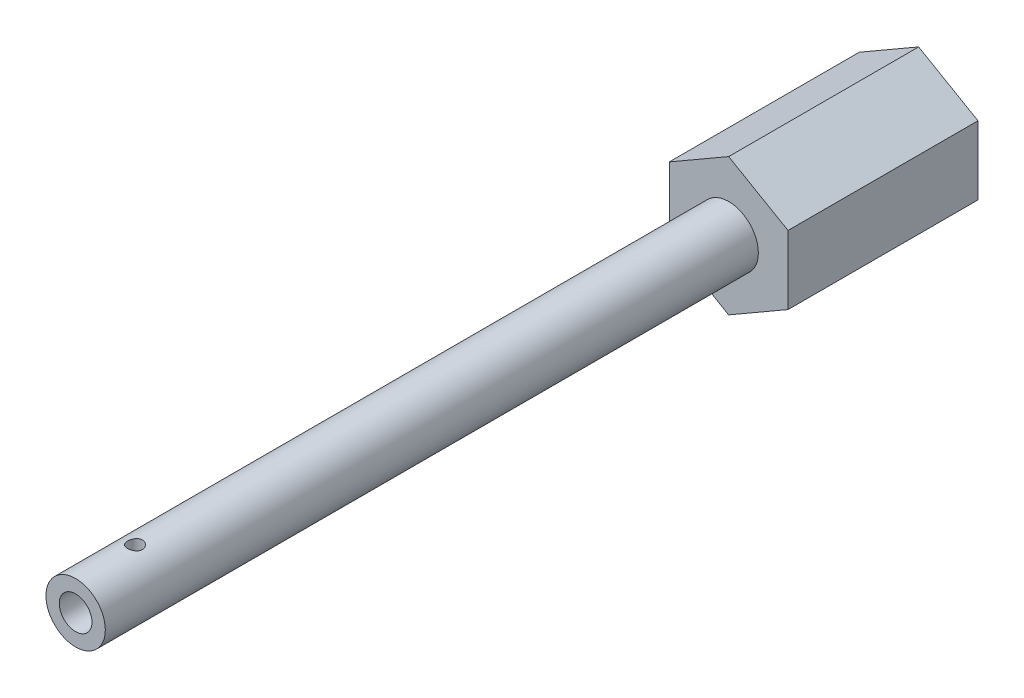
ISO-10303-21;
HEADER;
FILE_DESCRIPTION(('STEP AP214'),'2;1');
FILE_NAME('part.step','',(''),(''),'','','');
FILE_SCHEMA(('AUTOMOTIVE_DESIGN { 1 0 10303 214 1 1 1 1 }'));
ENDSEC;
DATA;
#1=APPLICATION_CONTEXT('core data for automotive mechanical design processes');
#2=APPLICATION_PROTOCOL_DEFINITION('international standard','automotive_design',2000,#1);
#3=PRODUCT_CONTEXT('',#1,'mechanical');
#4=PRODUCT('Part','Part','',(#3));
#5=PRODUCT_RELATED_PRODUCT_CATEGORY('part','',(#4));
#6=PRODUCT_DEFINITION_FORMATION('','',#4);
#7=PRODUCT_DEFINITION_CONTEXT('part definition',#1,'design');
#8=PRODUCT_DEFINITION('design','',#6,#7);
#9=PRODUCT_DEFINITION_SHAPE('','',#8);
#10=(LENGTH_UNIT() NAMED_UNIT(*) SI_UNIT(.MILLI.,.METRE.));
#11=(NAMED_UNIT(*) PLANE_ANGLE_UNIT() SI_UNIT($,.RADIAN.));
#12=(NAMED_UNIT(*) SI_UNIT($,.STERADIAN.) SOLID_ANGLE_UNIT());
#13=UNCERTAINTY_MEASURE_WITH_UNIT(LENGTH_MEASURE(1.E-05),#10,'distance_accuracy_value','');
#14=(GEOMETRIC_REPRESENTATION_CONTEXT(3) GLOBAL_UNCERTAINTY_ASSIGNED_CONTEXT((#13)) GLOBAL_UNIT_ASSIGNED_CONTEXT((#10,
#11,#12)) REPRESENTATION_CONTEXT('',''));
#15=CARTESIAN_POINT('',(0.,0.,0.));
#16=DIRECTION('',(0.,0.,1.));
#17=DIRECTION('',(1.,0.,0.));
#18=AXIS2_PLACEMENT_3D('',#15,#16,#17);
#19=CARTESIAN_POINT('',(6.35000000000004,-3.66617420935407,20.32));
#20=DIRECTION('',(-1.,0.,0.));
#21=DIRECTION('',(0.,-1.,0.));
#22=AXIS2_PLACEMENT_3D('',#19,#20,#21);
#23=PLANE('',#22);
#24=DIRECTION('',(0.,1.,0.));
#25=VECTOR('',#24,1.);
#26=CARTESIAN_POINT('',(6.35000000000004,-3.66617420935407,0.));
#27=LINE('',#26,#25);
#28=CARTESIAN_POINT('',(6.35000000000004,-3.66617420935407,0.));
#29=VERTEX_POINT('',#28);
#30=CARTESIAN_POINT('',(6.34999999999996,3.6661742093542,0.));
#31=VERTEX_POINT('',#30);
#32=EDGE_CURVE('E138',#29,#31,#27,.T.);
#33=ORIENTED_EDGE('',*,*,#32,.T.);
#34=DIRECTION('',(0.,0.,-1.));
#35=VECTOR('',#34,1.);
#36=CARTESIAN_POINT('',(6.34999999999996,3.6661742093542,20.32));
#37=LINE('',#36,#35);
#38=CARTESIAN_POINT('',(6.34999999999996,3.6661742093542,20.32));
#39=VERTEX_POINT('',#38);
#40=EDGE_CURVE('E56',#39,#31,#37,.T.);
#41=ORIENTED_EDGE('',*,*,#40,.F.);
#42=DIRECTION('',(0.,1.,0.));
#43=VECTOR('',#42,1.);
#44=CARTESIAN_POINT('',(6.35000000000004,-3.66617420935407,20.32));
#45=LINE('',#44,#43);
#46=CARTESIAN_POINT('',(6.35000000000004,-3.66617420935407,20.32));
#47=VERTEX_POINT('',#46);
#48=EDGE_CURVE('E147',#47,#39,#45,.T.);
#49=ORIENTED_EDGE('',*,*,#48,.F.);
#50=DIRECTION('',(0.,0.,-1.));
#51=VECTOR('',#50,1.);
#52=CARTESIAN_POINT('',(6.35000000000004,-3.66617420935407,20.32));
#53=LINE('',#52,#51);
#54=EDGE_CURVE('E131',#47,#29,#53,.T.);
#55=ORIENTED_EDGE('',*,*,#54,.T.);
#56=EDGE_LOOP('',(#33,#41,#49,#55));
#57=FACE_BOUND('',#56,.T.);
#58=ADVANCED_FACE('F44',(#57),#23,.F.);
#59=CARTESIAN_POINT('',(6.34999999999996,3.6661742093542,20.32));
#60=DIRECTION('',(-0.499999999999995,-0.866025403784442,0.));
#61=DIRECTION('',(0.866025403784442,-0.499999999999995,0.));
#62=AXIS2_PLACEMENT_3D('',#59,#60,#61);
#63=PLANE('',#62);
#64=DIRECTION('',(-0.866025403784441,0.499999999999995,0.));
#65=VECTOR('',#64,1.);
#66=CARTESIAN_POINT('',(6.34999999999996,3.6661742093542,0.));
#67=LINE('',#66,#65);
#68=CARTESIAN_POINT('',(0.,7.33234841870825,0.));
#69=VERTEX_POINT('',#68);
#70=EDGE_CURVE('E142',#31,#69,#67,.T.);
#71=ORIENTED_EDGE('',*,*,#70,.T.);
#72=DIRECTION('',(0.,0.,-1.));
#73=VECTOR('',#72,1.);
#74=CARTESIAN_POINT('',(0.,7.33234841870825,20.32));
#75=LINE('',#74,#73);
#76=CARTESIAN_POINT('',(0.,7.33234841870825,20.32));
#77=VERTEX_POINT('',#76);
#78=EDGE_CURVE('E152',#77,#69,#75,.T.);
#79=ORIENTED_EDGE('',*,*,#78,.F.);
#80=DIRECTION('',(-0.866025403784441,0.499999999999995,0.));
#81=VECTOR('',#80,1.);
#82=CARTESIAN_POINT('',(6.34999999999996,3.6661742093542,20.32));
#83=LINE('',#82,#81);
#84=EDGE_CURVE('E110',#39,#77,#83,.T.);
#85=ORIENTED_EDGE('',*,*,#84,.F.);
#86=ORIENTED_EDGE('',*,*,#40,.T.);
#87=EDGE_LOOP('',(#71,#79,#85,#86));
#88=FACE_BOUND('',#87,.T.);
#89=ADVANCED_FACE('F209',(#88),#63,.F.);
#90=CARTESIAN_POINT('',(0.,7.33234841870825,20.32));
#91=DIRECTION('',(0.500000000000001,-0.866025403784438,0.));
#92=DIRECTION('',(0.866025403784438,0.500000000000001,0.));
#93=AXIS2_PLACEMENT_3D('',#90,#91,#92);
#94=PLANE('',#93);
#95=DIRECTION('',(-0.866025403784438,-0.500000000000001,0.));
#96=VECTOR('',#95,1.);
#97=CARTESIAN_POINT('',(0.,7.33234841870825,0.));
#98=LINE('',#97,#96);
#99=CARTESIAN_POINT('',(-6.35000000000001,3.66617420935411,0.));
#100=VERTEX_POINT('',#99);
#101=EDGE_CURVE('E144',#69,#100,#98,.T.);
#102=ORIENTED_EDGE('',*,*,#101,.T.);
#103=DIRECTION('',(0.,0.,-1.));
#104=VECTOR('',#103,1.);
#105=CARTESIAN_POINT('',(-6.35000000000001,3.66617420935411,20.32));
#106=LINE('',#105,#104);
#107=CARTESIAN_POINT('',(-6.35000000000001,3.66617420935411,20.32));
#108=VERTEX_POINT('',#107);
#109=EDGE_CURVE('E128',#108,#100,#106,.T.);
#110=ORIENTED_EDGE('',*,*,#109,.F.);
#111=DIRECTION('',(-0.866025403784438,-0.500000000000001,0.));
#112=VECTOR('',#111,1.);
#113=CARTESIAN_POINT('',(0.,7.33234841870825,20.32));
#114=LINE('',#113,#112);
#115=EDGE_CURVE('E121',#77,#108,#114,.T.);
#116=ORIENTED_EDGE('',*,*,#115,.F.);
#117=ORIENTED_EDGE('',*,*,#78,.T.);
#118=EDGE_LOOP('',(#102,#110,#116,#117));
#119=FACE_BOUND('',#118,.T.);
#120=ADVANCED_FACE('F208',(#119),#94,.F.);
#121=CARTESIAN_POINT('',(-6.35000000000001,3.66617420935411,20.32));
#122=DIRECTION('',(1.,0.,0.));
#123=DIRECTION('',(0.,1.,0.));
#124=AXIS2_PLACEMENT_3D('',#121,#122,#123);
#125=PLANE('',#124);
#126=DIRECTION('',(0.,-1.,0.));
#127=VECTOR('',#126,1.);
#128=CARTESIAN_POINT('',(-6.35000000000001,3.66617420935411,0.));
#129=LINE('',#128,#127);
#130=CARTESIAN_POINT('',(-6.34999999999999,-3.66617420935416,0.));
#131=VERTEX_POINT('',#130);
#132=EDGE_CURVE('E129',#100,#131,#129,.T.);
#133=ORIENTED_EDGE('',*,*,#132,.T.);
#134=DIRECTION('',(0.,0.,-1.));
#135=VECTOR('',#134,1.);
#136=CARTESIAN_POINT('',(-6.34999999999999,-3.66617420935416,20.32));
#137=LINE('',#136,#135);
#138=CARTESIAN_POINT('',(-6.34999999999999,-3.66617420935416,20.32));
#139=VERTEX_POINT('',#138);
#140=EDGE_CURVE('E127',#139,#131,#137,.T.);
#141=ORIENTED_EDGE('',*,*,#140,.F.);
#142=DIRECTION('',(0.,-1.,0.));
#143=VECTOR('',#142,1.);
#144=CARTESIAN_POINT('',(-6.35000000000001,3.66617420935411,20.32));
#145=LINE('',#144,#143);
#146=EDGE_CURVE('E113',#108,#139,#145,.T.);
#147=ORIENTED_EDGE('',*,*,#146,.F.);
#148=ORIENTED_EDGE('',*,*,#109,.T.);
#149=EDGE_LOOP('',(#133,#141,#147,#148));
#150=FACE_BOUND('',#149,.T.);
#151=ADVANCED_FACE('F130',(#150),#125,.F.);
#152=CARTESIAN_POINT('',(-6.34999999999999,-3.66617420935416,20.32));
#153=DIRECTION('',(0.499999999999995,0.866025403784441,0.));
#154=DIRECTION('',(-0.866025403784442,0.499999999999995,0.));
#155=AXIS2_PLACEMENT_3D('',#152,#153,#154);
#156=PLANE('',#155);
#157=DIRECTION('',(0.866025403784442,-0.499999999999995,0.));
#158=VECTOR('',#157,1.);
#159=CARTESIAN_POINT('',(-6.34999999999999,-3.66617420935416,0.));
#160=LINE('',#159,#158);
#161=CARTESIAN_POINT('',(0.,-7.33234841870825,0.));
#162=VERTEX_POINT('',#161);
#163=EDGE_CURVE('E95',#131,#162,#160,.T.);
#164=ORIENTED_EDGE('',*,*,#163,.T.);
#165=DIRECTION('',(0.,0.,-1.));
#166=VECTOR('',#165,1.);
#167=CARTESIAN_POINT('',(0.,-7.33234841870825,20.32));
#168=LINE('',#167,#166);
#169=CARTESIAN_POINT('',(0.,-7.33234841870825,20.32));
#170=VERTEX_POINT('',#169);
#171=EDGE_CURVE('E133',#170,#162,#168,.T.);
#172=ORIENTED_EDGE('',*,*,#171,.F.);
#173=DIRECTION('',(0.866025403784442,-0.499999999999995,0.));
#174=VECTOR('',#173,1.);
#175=CARTESIAN_POINT('',(-6.34999999999999,-3.66617420935416,20.32));
#176=LINE('',#175,#174);
#177=EDGE_CURVE('E120',#139,#170,#176,.T.);
#178=ORIENTED_EDGE('',*,*,#177,.F.);
#179=ORIENTED_EDGE('',*,*,#140,.T.);
#180=EDGE_LOOP('',(#164,#172,#178,#179));
#181=FACE_BOUND('',#180,.T.);
#182=ADVANCED_FACE('F132',(#181),#156,.F.);
#183=CARTESIAN_POINT('',(0.,-7.33234841870825,20.32));
#184=DIRECTION('',(-0.500000000000007,0.866025403784435,0.));
#185=DIRECTION('',(-0.866025403784435,-0.500000000000007,0.));
#186=AXIS2_PLACEMENT_3D('',#183,#184,#185);
#187=PLANE('',#186);
#188=DIRECTION('',(0.866025403784435,0.500000000000007,0.));
#189=VECTOR('',#188,1.);
#190=CARTESIAN_POINT('',(0.,-7.33234841870825,0.));
#191=LINE('',#190,#189);
#192=EDGE_CURVE('E98',#162,#29,#191,.T.);
#193=ORIENTED_EDGE('',*,*,#192,.T.);
#194=ORIENTED_EDGE('',*,*,#54,.F.);
#195=DIRECTION('',(0.866025403784435,0.500000000000007,0.));
#196=VECTOR('',#195,1.);
#197=CARTESIAN_POINT('',(0.,-7.33234841870825,20.32));
#198=LINE('',#197,#196);
#199=EDGE_CURVE('E69',#170,#47,#198,.T.);
#200=ORIENTED_EDGE('',*,*,#199,.F.);
#201=ORIENTED_EDGE('',*,*,#171,.T.);
#202=EDGE_LOOP('',(#193,#194,#200,#201));
#203=FACE_BOUND('',#202,.T.);
#204=ADVANCED_FACE('F197',(#203),#187,.F.);
#205=CARTESIAN_POINT('',(0.,0.,20.32));
#206=DIRECTION('',(0.,0.,1.));
#207=DIRECTION('',(1.,0.,0.));
#208=AXIS2_PLACEMENT_3D('',#205,#206,#207);
#209=PLANE('',#208);
#210=CARTESIAN_POINT('',(0.,0.,20.32));
#211=DIRECTION('',(0.,0.,1.));
#212=DIRECTION('',(1.,0.,0.));
#213=AXIS2_PLACEMENT_3D('',#210,#211,#212);
#214=CIRCLE('',#213,3.175);
#215=CARTESIAN_POINT('',(3.175,0.,20.32));
#216=VERTEX_POINT('',#215);
#217=EDGE_CURVE('E11',#216,#216,#214,.T.);
#218=ORIENTED_EDGE('',*,*,#217,.F.);
#219=EDGE_LOOP('',(#218));
#220=FACE_BOUND('',#219,.T.);
#221=ORIENTED_EDGE('',*,*,#48,.T.);
#222=ORIENTED_EDGE('',*,*,#84,.T.);
#223=ORIENTED_EDGE('',*,*,#115,.T.);
#224=ORIENTED_EDGE('',*,*,#146,.T.);
#225=ORIENTED_EDGE('',*,*,#177,.T.);
#226=ORIENTED_EDGE('',*,*,#199,.T.);
#227=EDGE_LOOP('',(#221,#222,#223,#224,#225,#226));
#228=FACE_BOUND('',#227,.T.);
#229=ADVANCED_FACE('F119',(#220,#228),#209,.T.);
#230=CARTESIAN_POINT('',(0.,0.,0.));
#231=DIRECTION('',(0.,0.,1.));
#232=DIRECTION('',(1.,0.,0.));
#233=AXIS2_PLACEMENT_3D('',#230,#231,#232);
#234=PLANE('',#233);
#235=ORIENTED_EDGE('',*,*,#32,.F.);
#236=ORIENTED_EDGE('',*,*,#192,.F.);
#237=ORIENTED_EDGE('',*,*,#163,.F.);
#238=ORIENTED_EDGE('',*,*,#132,.F.);
#239=ORIENTED_EDGE('',*,*,#101,.F.);
#240=ORIENTED_EDGE('',*,*,#70,.F.);
#241=EDGE_LOOP('',(#235,#236,#237,#238,#239,#240));
#242=FACE_BOUND('',#241,.T.);
#243=ADVANCED_FACE('F192',(#242),#234,.F.);
#244=CARTESIAN_POINT('',(0.,0.,90.17));
#245=DIRECTION('',(0.,0.,-1.));
#246=DIRECTION('',(-1.,0.,0.));
#247=AXIS2_PLACEMENT_3D('',#244,#245,#246);
#248=CYLINDRICAL_SURFACE('',#247,3.175);
#249=CARTESIAN_POINT('',(0.,-3.175,84.61375));
#250=CARTESIAN_POINT('',(0.0438552635877317,-3.17499925846823,84.6137487692969));
#251=CARTESIAN_POINT('',(0.0877242751854435,-3.17408230928092,84.6101032210489));
#252=CARTESIAN_POINT('',(0.174205012995238,-3.17051326901651,84.5956391907667));
#253=CARTESIAN_POINT('',(0.216816012302431,-3.167860194514,84.5848166432862));
#254=CARTESIAN_POINT('',(0.299519378196612,-3.16111268934038,84.5563675617096));
#255=CARTESIAN_POINT('',(0.339614702315041,-3.15701999003938,84.5387491981798));
#256=CARTESIAN_POINT('',(0.416280669799421,-3.14782911098185,84.4972373477679));
#257=CARTESIAN_POINT('',(0.452851194217879,-3.14273089731102,84.4733436492204));
#258=CARTESIAN_POINT('',(0.522182686530061,-3.13196506358995,84.4194395821413));
#259=CARTESIAN_POINT('',(0.554860719323974,-3.12628865866099,84.3893242915841));
#260=CARTESIAN_POINT('',(0.61475880731174,-3.11506457312193,84.324056541569));
#261=CARTESIAN_POINT('',(0.64197824621891,-3.10951690710918,84.2889035141075));
#262=CARTESIAN_POINT('',(0.690576545564482,-3.0990898547443,84.2139141925181));
#263=CARTESIAN_POINT('',(0.711862630927161,-3.09422162074029,84.1740160820295));
#264=CARTESIAN_POINT('',(0.747393364107979,-3.08583274338135,84.0910664654974));
#265=CARTESIAN_POINT('',(0.76163913766997,-3.08231188460184,84.0480154648651));
#266=CARTESIAN_POINT('',(0.782401934475594,-3.07710668929704,83.9608940655345));
#267=CARTESIAN_POINT('',(0.789068075326383,-3.07538697360746,83.916861367507));
#268=CARTESIAN_POINT('',(0.794946855973397,-3.07387287676221,83.8282716322301));
#269=CARTESIAN_POINT('',(0.794160708378673,-3.07407818237408,83.7837146814637));
#270=CARTESIAN_POINT('',(0.785276202621612,-3.07635912908627,83.6964841350686));
#271=CARTESIAN_POINT('',(0.777355538350808,-3.07838931671828,83.6537910669747));
#272=CARTESIAN_POINT('',(0.754710298902886,-3.08401883870473,83.5703597772261));
#273=CARTESIAN_POINT('',(0.739985239011729,-3.08761828484494,83.5296216950638));
#274=CARTESIAN_POINT('',(0.703997765408402,-3.09602247774299,83.4507802997333));
#275=CARTESIAN_POINT('',(0.682670861410738,-3.10083902452569,83.4127077340947));
#276=CARTESIAN_POINT('',(0.634130196057904,-3.11112805322879,83.340618016087));
#277=CARTESIAN_POINT('',(0.606915404578003,-3.11660064985464,83.3066015749811));
#278=CARTESIAN_POINT('',(0.546451062227143,-3.12777653452301,83.2425714200284));
#279=CARTESIAN_POINT('',(0.513051561612771,-3.1334819509876,83.2126994990092));
#280=CARTESIAN_POINT('',(0.441648806345713,-3.14433990118774,83.1589537591962));
#281=CARTESIAN_POINT('',(0.403645411120456,-3.14949241803232,83.1350801236189));
#282=CARTESIAN_POINT('',(0.323911324427235,-3.15868966566505,83.0939565647896));
#283=CARTESIAN_POINT('',(0.282168278906228,-3.16273053067588,83.0767296741154));
#284=CARTESIAN_POINT('',(0.196255220975604,-3.16922106074626,83.0495770923954));
#285=CARTESIAN_POINT('',(0.152085674550458,-3.17167103017036,83.0396500047288));
#286=CARTESIAN_POINT('',(0.0637857343313822,-3.17465868364436,83.0275953715585));
#287=CARTESIAN_POINT('',(0.0196832643270895,-3.17524369981464,83.0252747320352));
#288=CARTESIAN_POINT('',(-0.0682798962491337,-3.17457034214314,83.0279692635877));
#289=CARTESIAN_POINT('',(-0.1121406082286,-3.1733121342381,83.0329837743145));
#290=CARTESIAN_POINT('',(-0.19770421722756,-3.1691240334656,83.0500471056904));
#291=CARTESIAN_POINT('',(-0.239429458787631,-3.16621918923325,83.0619905852566));
#292=CARTESIAN_POINT('',(-0.320281983922785,-3.15906523927229,83.0924524986317));
#293=CARTESIAN_POINT('',(-0.359409004654769,-3.15481599779068,83.1109715964491));
#294=CARTESIAN_POINT('',(-0.434722658635791,-3.14533125444339,83.1544332848629));
#295=CARTESIAN_POINT('',(-0.470844796304786,-3.14007958981668,83.1794840261433));
#296=CARTESIAN_POINT('',(-0.538441166386209,-3.12919802778343,83.2351596600717));
#297=CARTESIAN_POINT('',(-0.569914594956545,-3.12356806520694,83.265785514714));
#298=CARTESIAN_POINT('',(-0.628115842271814,-3.11239406391742,83.3326385376135));
#299=CARTESIAN_POINT('',(-0.654708213283317,-3.10685552632436,83.3689847428388));
#300=CARTESIAN_POINT('',(-0.701416109977545,-3.09664564807956,83.4457376857381));
#301=CARTESIAN_POINT('',(-0.721531923158569,-3.09197426893801,83.4861442430662));
#302=CARTESIAN_POINT('',(-0.754565960072411,-3.0840790846376,83.5696542781103));
#303=CARTESIAN_POINT('',(-0.767526826562769,-3.08084672591967,83.6127400366654));
#304=CARTESIAN_POINT('',(-0.785995411725532,-3.07618735414389,83.700572183383));
#305=CARTESIAN_POINT('',(-0.791504760374115,-3.074759946268,83.7453182061714));
#306=CARTESIAN_POINT('',(-0.794828754051731,-3.07390218553761,83.8338223751234));
#307=CARTESIAN_POINT('',(-0.792859887575304,-3.0744156440204,83.8775719760868));
#308=CARTESIAN_POINT('',(-0.781778809773884,-3.07725185183317,83.9640941410868));
#309=CARTESIAN_POINT('',(-0.772666742005074,-3.07957456480274,84.0068667247406));
#310=CARTESIAN_POINT('',(-0.74767615653847,-3.08573625444607,84.0899853095888));
#311=CARTESIAN_POINT('',(-0.731838243310023,-3.08956612229214,84.1303442406896));
#312=CARTESIAN_POINT('',(-0.693877683449341,-3.09831187404389,84.2078608483527));
#313=CARTESIAN_POINT('',(-0.671754165143082,-3.10322790855576,84.2450180799781));
#314=CARTESIAN_POINT('',(-0.621171683653811,-3.11375231464442,84.3161226578469));
#315=CARTESIAN_POINT('',(-0.592562507041063,-3.11937540140138,84.3499609846868));
#316=CARTESIAN_POINT('',(-0.530113542254564,-3.1305924775116,84.4124269778709));
#317=CARTESIAN_POINT('',(-0.496272513750685,-3.13618645963902,84.4410534051014));
#318=CARTESIAN_POINT('',(-0.423580764630118,-3.14683592780222,84.4927884841154));
#319=CARTESIAN_POINT('',(-0.38465041514242,-3.15187982656105,84.5157878164012));
#320=CARTESIAN_POINT('',(-0.303353289824295,-3.16073856132667,84.554878865806));
#321=CARTESIAN_POINT('',(-0.260989002318609,-3.16455427751551,84.5709755325098));
#322=CARTESIAN_POINT('',(-0.18225042567467,-3.16996264853432,84.5934150935494));
#323=CARTESIAN_POINT('',(-0.146251173772186,-3.17183867923715,84.6010241994491));
#324=CARTESIAN_POINT('',(-0.0735044628546157,-3.17435761935239,84.6111919784999));
#325=CARTESIAN_POINT('',(-0.0367570603242174,-3.17500062151098,84.6137510315074));
#326=CARTESIAN_POINT('',(0.,-3.175,84.61375));
#327=B_SPLINE_CURVE_WITH_KNOTS('',3,(#249,#250,#251,#252,#253,#254,#255,#256,#257,#258,#259,
#260,#261,#262,#263,#264,#265,#266,#267,#268,#269,#270,#271,#272,#273,#274,#275,#276,#277,#278,
#279,#280,#281,#282,#283,#284,#285,#286,#287,#288,#289,#290,#291,#292,#293,#294,#295,#296,#297,
#298,#299,#300,#301,#302,#303,#304,#305,#306,#307,#308,#309,#310,#311,#312,#313,#314,#315,#316,
#317,#318,#319,#320,#321,#322,#323,#324,#325,#326),.UNSPECIFIED.,.T.,.F.,(4,2,2,2,2,2,2,2,2,2,2,
2,2,2,2,2,2,2,2,2,2,2,2,2,2,2,2,2,2,2,2,2,2,2,2,2,2,2,4),(0.,0.131431089516374,
0.262936692483394,0.394284677459729,0.525637093339595,0.659418054188175,0.793214110694487,
0.92899784326322,1.06475985702122,1.1978020615678,1.33082261834634,1.46061904666212,
1.59042472250778,1.72154070999927,1.85267965567467,1.98755794262769,2.12244034891236,
2.25778604517321,2.39310583993572,2.5249627181899,2.65680772672157,2.78669895263676,
2.91660329874709,3.04881273419995,3.18104500425074,3.31652302787364,3.45199503671611,
3.58665068066591,3.72127686471062,3.85203583794261,3.98279218339231,4.11277011962703,
4.24276608972439,4.37615317516907,4.50957193170174,4.64540698160193,4.78114446688793,
4.89131103556882,5.00146931739437),.UNSPECIFIED.);
#328=CARTESIAN_POINT('',(0.,-3.175,84.61375));
#329=VERTEX_POINT('',#328);
#330=EDGE_CURVE('E182',#329,#329,#327,.T.);
#331=ORIENTED_EDGE('',*,*,#330,.T.);
#332=EDGE_LOOP('',(#331));
#333=FACE_BOUND('',#332,.T.);
#334=CARTESIAN_POINT('',(0.,3.175,84.61375));
#335=CARTESIAN_POINT('',(-0.0438552635877317,3.17499925846823,84.6137487692969));
#336=CARTESIAN_POINT('',(-0.0877242751854435,3.17408230928092,84.6101032210489));
#337=CARTESIAN_POINT('',(-0.174205012995238,3.17051326901651,84.5956391907667));
#338=CARTESIAN_POINT('',(-0.216816012302431,3.167860194514,84.5848166432862));
#339=CARTESIAN_POINT('',(-0.299519378196612,3.16111268934038,84.5563675617096));
#340=CARTESIAN_POINT('',(-0.339614702315041,3.15701999003938,84.5387491981798));
#341=CARTESIAN_POINT('',(-0.416280669799421,3.14782911098185,84.4972373477679));
#342=CARTESIAN_POINT('',(-0.452851194217879,3.14273089731102,84.4733436492204));
#343=CARTESIAN_POINT('',(-0.522182686530061,3.13196506358995,84.4194395821413));
#344=CARTESIAN_POINT('',(-0.554860719323974,3.12628865866099,84.3893242915841));
#345=CARTESIAN_POINT('',(-0.61475880731174,3.11506457312193,84.324056541569));
#346=CARTESIAN_POINT('',(-0.64197824621891,3.10951690710918,84.2889035141075));
#347=CARTESIAN_POINT('',(-0.690576545564482,3.0990898547443,84.2139141925181));
#348=CARTESIAN_POINT('',(-0.711862630927161,3.09422162074029,84.1740160820295));
#349=CARTESIAN_POINT('',(-0.747393364107979,3.08583274338135,84.0910664654974));
#350=CARTESIAN_POINT('',(-0.76163913766997,3.08231188460184,84.0480154648651));
#351=CARTESIAN_POINT('',(-0.782401934475594,3.07710668929704,83.9608940655345));
#352=CARTESIAN_POINT('',(-0.789068075326383,3.07538697360746,83.916861367507));
#353=CARTESIAN_POINT('',(-0.794946855973397,3.07387287676221,83.8282716322301));
#354=CARTESIAN_POINT('',(-0.794160708378673,3.07407818237408,83.7837146814637));
#355=CARTESIAN_POINT('',(-0.785276202621612,3.07635912908627,83.6964841350686));
#356=CARTESIAN_POINT('',(-0.777355538350808,3.07838931671828,83.6537910669747));
#357=CARTESIAN_POINT('',(-0.754710298902886,3.08401883870473,83.5703597772261));
#358=CARTESIAN_POINT('',(-0.739985239011729,3.08761828484494,83.5296216950638));
#359=CARTESIAN_POINT('',(-0.703997765408402,3.09602247774299,83.4507802997333));
#360=CARTESIAN_POINT('',(-0.682670861410738,3.10083902452569,83.4127077340947));
#361=CARTESIAN_POINT('',(-0.634130196057904,3.11112805322879,83.340618016087));
#362=CARTESIAN_POINT('',(-0.606915404578003,3.11660064985464,83.3066015749811));
#363=CARTESIAN_POINT('',(-0.546451062227143,3.12777653452301,83.2425714200284));
#364=CARTESIAN_POINT('',(-0.513051561612771,3.1334819509876,83.2126994990092));
#365=CARTESIAN_POINT('',(-0.441648806345713,3.14433990118774,83.1589537591962));
#366=CARTESIAN_POINT('',(-0.403645411120456,3.14949241803232,83.1350801236189));
#367=CARTESIAN_POINT('',(-0.323911324427235,3.15868966566505,83.0939565647896));
#368=CARTESIAN_POINT('',(-0.282168278906228,3.16273053067588,83.0767296741154));
#369=CARTESIAN_POINT('',(-0.196255220975604,3.16922106074626,83.0495770923954));
#370=CARTESIAN_POINT('',(-0.152085674550458,3.17167103017036,83.0396500047288));
#371=CARTESIAN_POINT('',(-0.0637857343313822,3.17465868364436,83.0275953715585));
#372=CARTESIAN_POINT('',(-0.0196832643270895,3.17524369981464,83.0252747320352));
#373=CARTESIAN_POINT('',(0.0682798962491337,3.17457034214314,83.0279692635877));
#374=CARTESIAN_POINT('',(0.1121406082286,3.1733121342381,83.0329837743145));
#375=CARTESIAN_POINT('',(0.19770421722756,3.1691240334656,83.0500471056904));
#376=CARTESIAN_POINT('',(0.239429458787631,3.16621918923325,83.0619905852566));
#377=CARTESIAN_POINT('',(0.320281983922785,3.15906523927229,83.0924524986317));
#378=CARTESIAN_POINT('',(0.359409004654769,3.15481599779068,83.1109715964491));
#379=CARTESIAN_POINT('',(0.434722658635791,3.14533125444339,83.1544332848629));
#380=CARTESIAN_POINT('',(0.470844796304786,3.14007958981668,83.1794840261433));
#381=CARTESIAN_POINT('',(0.538441166386209,3.12919802778343,83.2351596600717));
#382=CARTESIAN_POINT('',(0.569914594956545,3.12356806520694,83.265785514714));
#383=CARTESIAN_POINT('',(0.628115842271814,3.11239406391742,83.3326385376135));
#384=CARTESIAN_POINT('',(0.654708213283317,3.10685552632436,83.3689847428388));
#385=CARTESIAN_POINT('',(0.701416109977545,3.09664564807956,83.4457376857381));
#386=CARTESIAN_POINT('',(0.721531923158569,3.09197426893801,83.4861442430662));
#387=CARTESIAN_POINT('',(0.754565960072411,3.0840790846376,83.5696542781103));
#388=CARTESIAN_POINT('',(0.767526826562769,3.08084672591967,83.6127400366654));
#389=CARTESIAN_POINT('',(0.785995411725532,3.07618735414389,83.700572183383));
#390=CARTESIAN_POINT('',(0.791504760374115,3.074759946268,83.7453182061714));
#391=CARTESIAN_POINT('',(0.794828754051731,3.07390218553761,83.8338223751234));
#392=CARTESIAN_POINT('',(0.792859887575304,3.0744156440204,83.8775719760868));
#393=CARTESIAN_POINT('',(0.781778809773884,3.07725185183317,83.9640941410868));
#394=CARTESIAN_POINT('',(0.772666742005074,3.07957456480274,84.0068667247406));
#395=CARTESIAN_POINT('',(0.74767615653847,3.08573625444607,84.0899853095888));
#396=CARTESIAN_POINT('',(0.731838243310023,3.08956612229214,84.1303442406896));
#397=CARTESIAN_POINT('',(0.693877683449341,3.09831187404389,84.2078608483527));
#398=CARTESIAN_POINT('',(0.671754165143082,3.10322790855576,84.2450180799781));
#399=CARTESIAN_POINT('',(0.621171683653811,3.11375231464442,84.3161226578469));
#400=CARTESIAN_POINT('',(0.592562507041063,3.11937540140138,84.3499609846868));
#401=CARTESIAN_POINT('',(0.530113542254564,3.1305924775116,84.4124269778709));
#402=CARTESIAN_POINT('',(0.496272513750685,3.13618645963902,84.4410534051014));
#403=CARTESIAN_POINT('',(0.423580764630118,3.14683592780222,84.4927884841154));
#404=CARTESIAN_POINT('',(0.38465041514242,3.15187982656105,84.5157878164012));
#405=CARTESIAN_POINT('',(0.303353289824295,3.16073856132667,84.554878865806));
#406=CARTESIAN_POINT('',(0.260989002318609,3.16455427751551,84.5709755325098));
#407=CARTESIAN_POINT('',(0.18225042567467,3.16996264853432,84.5934150935494));
#408=CARTESIAN_POINT('',(0.146251173772186,3.17183867923715,84.6010241994491));
#409=CARTESIAN_POINT('',(0.0735044628546157,3.17435761935239,84.6111919784999));
#410=CARTESIAN_POINT('',(0.0367570603242174,3.17500062151098,84.6137510315074));
#411=CARTESIAN_POINT('',(0.,3.175,84.61375));
#412=B_SPLINE_CURVE_WITH_KNOTS('',3,(#334,#335,#336,#337,#338,#339,#340,#341,#342,#343,#344,
#345,#346,#347,#348,#349,#350,#351,#352,#353,#354,#355,#356,#357,#358,#359,#360,#361,#362,#363,
#364,#365,#366,#367,#368,#369,#370,#371,#372,#373,#374,#375,#376,#377,#378,#379,#380,#381,#382,
#383,#384,#385,#386,#387,#388,#389,#390,#391,#392,#393,#394,#395,#396,#397,#398,#399,#400,#401,
#402,#403,#404,#405,#406,#407,#408,#409,#410,#411),.UNSPECIFIED.,.T.,.F.,(4,2,2,2,2,2,2,2,2,2,2,
2,2,2,2,2,2,2,2,2,2,2,2,2,2,2,2,2,2,2,2,2,2,2,2,2,2,2,4),(0.,0.131431089516374,
0.262936692483394,0.394284677459729,0.525637093339595,0.659418054188175,0.793214110694487,
0.92899784326322,1.06475985702122,1.1978020615678,1.33082261834634,1.46061904666212,
1.59042472250778,1.72154070999927,1.85267965567467,1.98755794262769,2.12244034891236,
2.25778604517321,2.39310583993572,2.5249627181899,2.65680772672157,2.78669895263676,
2.91660329874709,3.04881273419995,3.18104500425074,3.31652302787364,3.45199503671611,
3.58665068066591,3.72127686471062,3.85203583794261,3.98279218339231,4.11277011962703,
4.24276608972439,4.37615317516907,4.50957193170174,4.64540698160193,4.78114446688793,
4.89131103556882,5.00146931739437),.UNSPECIFIED.);
#413=CARTESIAN_POINT('',(0.,3.175,84.61375));
#414=VERTEX_POINT('',#413);
#415=EDGE_CURVE('E165',#414,#414,#412,.T.);
#416=ORIENTED_EDGE('',*,*,#415,.T.);
#417=EDGE_LOOP('',(#416));
#418=FACE_BOUND('',#417,.T.);
#419=CARTESIAN_POINT('',(0.,0.,90.17));
#420=DIRECTION('',(0.,0.,1.));
#421=DIRECTION('',(1.,0.,0.));
#422=AXIS2_PLACEMENT_3D('',#419,#420,#421);
#423=CIRCLE('',#422,3.175);
#424=CARTESIAN_POINT('',(3.175,0.,90.17));
#425=VERTEX_POINT('',#424);
#426=EDGE_CURVE('E141',#425,#425,#423,.T.);
#427=ORIENTED_EDGE('',*,*,#426,.F.);
#428=EDGE_LOOP('',(#427));
#429=FACE_BOUND('',#428,.T.);
#430=ORIENTED_EDGE('',*,*,#217,.T.);
#431=EDGE_LOOP('',(#430));
#432=FACE_BOUND('',#431,.T.);
#433=ADVANCED_FACE('F188',(#333,#418,#429,#432),#248,.T.);
#434=CARTESIAN_POINT('',(0.,0.,90.17));
#435=DIRECTION('',(0.,0.,1.));
#436=DIRECTION('',(1.,0.,0.));
#437=AXIS2_PLACEMENT_3D('',#434,#435,#436);
#438=PLANE('',#437);
#439=CARTESIAN_POINT('',(0.,0.,90.17));
#440=DIRECTION('',(0.,0.,1.));
#441=DIRECTION('',(1.,0.,0.));
#442=AXIS2_PLACEMENT_3D('',#439,#440,#441);
#443=CIRCLE('',#442,1.74999999999999);
#444=CARTESIAN_POINT('',(1.74999999999999,0.,90.17));
#445=VERTEX_POINT('',#444);
#446=EDGE_CURVE('E227',#445,#445,#443,.T.);
#447=ORIENTED_EDGE('',*,*,#446,.F.);
#448=EDGE_LOOP('',(#447));
#449=FACE_BOUND('',#448,.T.);
#450=ORIENTED_EDGE('',*,*,#426,.T.);
#451=EDGE_LOOP('',(#450));
#452=FACE_BOUND('',#451,.T.);
#453=ADVANCED_FACE('F191',(#449,#452),#438,.T.);
#454=CARTESIAN_POINT('',(0.,0.,64.77));
#455=DIRECTION('',(0.,0.,1.));
#456=DIRECTION('',(1.,0.,0.));
#457=AXIS2_PLACEMENT_3D('',#454,#455,#456);
#458=CONICAL_SURFACE('',#457,1.75,1.02974425867665);
#459=CARTESIAN_POINT('',(0.,0.,63.7184939167018));
#460=VERTEX_POINT('',#459);
#461=VERTEX_LOOP('',#460);
#462=FACE_BOUND('',#461,.T.);
#463=CARTESIAN_POINT('',(0.,0.,64.77));
#464=DIRECTION('',(0.,0.,1.));
#465=DIRECTION('',(1.,0.,0.));
#466=AXIS2_PLACEMENT_3D('',#463,#464,#465);
#467=CIRCLE('',#466,1.75);
#468=CARTESIAN_POINT('',(1.75,0.,64.77));
#469=VERTEX_POINT('',#468);
#470=EDGE_CURVE('E228',#469,#469,#467,.T.);
#471=ORIENTED_EDGE('',*,*,#470,.T.);
#472=EDGE_LOOP('',(#471));
#473=FACE_BOUND('',#472,.T.);
#474=ADVANCED_FACE('F238',(#462,#473),#458,.F.);
#475=CARTESIAN_POINT('',(0.,0.,90.17));
#476=DIRECTION('',(0.,0.,1.));
#477=DIRECTION('',(1.,0.,0.));
#478=AXIS2_PLACEMENT_3D('',#475,#476,#477);
#479=CYLINDRICAL_SURFACE('',#478,1.74999999999999);
#480=CARTESIAN_POINT('',(0.,-1.74999999999999,84.61375));
#481=CARTESIAN_POINT('',(-0.0421881518719493,-1.74999612992706,84.6137450112485));
#482=CARTESIAN_POINT('',(-0.0844240233419914,-1.74845757189418,84.6103674007551));
#483=CARTESIAN_POINT('',(-0.167683820977792,-1.74245085953981,84.5969863935373));
#484=CARTESIAN_POINT('',(-0.208704692738083,-1.73797588495933,84.5869675710688));
#485=CARTESIAN_POINT('',(-0.288187973002065,-1.72657281587175,84.5607638223991));
#486=CARTESIAN_POINT('',(-0.326659067357287,-1.71965361829561,84.5446012433512));
#487=CARTESIAN_POINT('',(-0.400299931553999,-1.70401847656604,84.5066701207976));
#488=CARTESIAN_POINT('',(-0.435470370126493,-1.69530289751808,84.4849027162205));
#489=CARTESIAN_POINT('',(-0.503587604898425,-1.67636929960287,84.4350703366536));
#490=CARTESIAN_POINT('',(-0.536321275309244,-1.66609648005544,84.4067351116636));
#491=CARTESIAN_POINT('',(-0.596761333343323,-1.64541734362848,84.3451462011578));
#492=CARTESIAN_POINT('',(-0.624464599180176,-1.63501094811324,84.3118894845196));
#493=CARTESIAN_POINT('',(-0.675731448524965,-1.61452640247469,84.2389635603518));
#494=CARTESIAN_POINT('',(-0.698941384080944,-1.60450658208024,84.1990275547658));
#495=CARTESIAN_POINT('',(-0.73822010471076,-1.58682023458879,84.1153040468456));
#496=CARTESIAN_POINT('',(-0.754293219939466,-1.57915228140873,84.071518899293));
#497=CARTESIAN_POINT('',(-0.777922640797905,-1.56764209486602,83.983784920514));
#498=CARTESIAN_POINT('',(-0.785891848617092,-1.56361569264893,83.9399725073592));
#499=CARTESIAN_POINT('',(-0.79436884696081,-1.55932781154676,83.8514619288859));
#500=CARTESIAN_POINT('',(-0.794881946382376,-1.55906365387164,83.8067644164853));
#501=CARTESIAN_POINT('',(-0.788739175224573,-1.56217727884383,83.722252284187));
#502=CARTESIAN_POINT('',(-0.782752890026483,-1.56521493335516,83.6823737371031));
#503=CARTESIAN_POINT('',(-0.764920072865138,-1.57400605342639,83.6042643375987));
#504=CARTESIAN_POINT('',(-0.753072150396759,-1.5797601633725,83.5660338784801));
#505=CARTESIAN_POINT('',(-0.723618077372435,-1.59346942488217,83.4912628641361));
#506=CARTESIAN_POINT('',(-0.705887125113801,-1.60147164752787,83.4547804975518));
#507=CARTESIAN_POINT('',(-0.665260749483215,-1.61876957097724,83.3851509070969));
#508=CARTESIAN_POINT('',(-0.642363114458368,-1.62806582504988,83.3520051202969));
#509=CARTESIAN_POINT('',(-0.589321879094503,-1.64805372831711,83.2864336279189));
#510=CARTESIAN_POINT('',(-0.558677658510176,-1.65879103640574,83.254425519338));
#511=CARTESIAN_POINT('',(-0.492372690634497,-1.67966566746727,83.1958478675852));
#512=CARTESIAN_POINT('',(-0.456710307077035,-1.68980279320154,83.1692801053055));
#513=CARTESIAN_POINT('',(-0.379910856998404,-1.70873607217358,83.1215634193754));
#514=CARTESIAN_POINT('',(-0.338635334555607,-1.71747906814298,83.1006146235034));
#515=CARTESIAN_POINT('',(-0.252647517116049,-1.73221433803183,83.066109827298));
#516=CARTESIAN_POINT('',(-0.207937501277872,-1.73820841805579,83.0525489718044));
#517=CARTESIAN_POINT('',(-0.119812204176171,-1.74641364671073,83.0341488550472));
#518=CARTESIAN_POINT('',(-0.0765361172129774,-1.74886645504382,83.0287510993669));
#519=CARTESIAN_POINT('',(0.0103706687020674,-1.75050807981352,83.0251283551944));
#520=CARTESIAN_POINT('',(0.0540012348054567,-1.74969806741355,83.0269007930195));
#521=CARTESIAN_POINT('',(0.13756101449896,-1.74505663397324,83.0371972623919));
#522=CARTESIAN_POINT('',(0.177553557545054,-1.74141273213713,83.0453024065977));
#523=CARTESIAN_POINT('',(0.255551863967043,-1.73168670413328,83.0674202957155));
#524=CARTESIAN_POINT('',(0.293557388848907,-1.72560428603595,83.0814337479572));
#525=CARTESIAN_POINT('',(0.367846348779018,-1.71133425034668,83.1154089674599));
#526=CARTESIAN_POINT('',(0.404039690008146,-1.70308713812592,83.1355418967427));
#527=CARTESIAN_POINT('',(0.472664198090473,-1.68533289108932,83.1809980381134));
#528=CARTESIAN_POINT('',(0.505093706115091,-1.6758252046275,83.2063235252083));
#529=CARTESIAN_POINT('',(0.568130382727783,-1.65557046619108,83.2639081265342));
#530=CARTESIAN_POINT('',(0.598358719062772,-1.64478624418048,83.2965698321074));
#531=CARTESIAN_POINT('',(0.65303979280115,-1.62385288677709,83.3666200455488));
#532=CARTESIAN_POINT('',(0.677490203625058,-1.61370400842121,83.4040104482354));
#533=CARTESIAN_POINT('',(0.720497308165285,-1.59497662558113,83.4838003866114));
#534=CARTESIAN_POINT('',(0.738877116638297,-1.58644789932466,83.5263078824911));
#535=CARTESIAN_POINT('',(0.76803771114896,-1.57254049761336,83.6143285608834));
#536=CARTESIAN_POINT('',(0.778826332380144,-1.5671585751788,83.6598385911102));
#537=CARTESIAN_POINT('',(0.791656578518688,-1.56071352488667,83.7483078028995));
#538=CARTESIAN_POINT('',(0.794378100237147,-1.55931511840841,83.7911439993075));
#539=CARTESIAN_POINT('',(0.79287844768847,-1.56007851671157,83.8766571098877));
#540=CARTESIAN_POINT('',(0.788658928897809,-1.56223947256557,83.9193340596082));
#541=CARTESIAN_POINT('',(0.773999577820075,-1.569549016298,84.0004194113531));
#542=CARTESIAN_POINT('',(0.763983166684695,-1.57449366319469,84.0389247167014));
#543=CARTESIAN_POINT('',(0.738472803180526,-1.58661785939495,84.1136982531378));
#544=CARTESIAN_POINT('',(0.722977249747254,-1.59379806187863,84.1499658266943));
#545=CARTESIAN_POINT('',(0.685797689269457,-1.61016114863854,84.2218237486138));
#546=CARTESIAN_POINT('',(0.663776522290099,-1.619443967979,84.2572163565733));
#547=CARTESIAN_POINT('',(0.61459781563045,-1.63873942951868,84.3240143820797));
#548=CARTESIAN_POINT('',(0.587438021507835,-1.64875239085969,84.3554180394302));
#549=CARTESIAN_POINT('',(0.525782223712342,-1.6694924294672,84.4163555756344));
#550=CARTESIAN_POINT('',(0.490839680440165,-1.6801997279623,84.4454467163301));
#551=CARTESIAN_POINT('',(0.416203656992761,-1.7002251541702,84.4974073173605));
#552=CARTESIAN_POINT('',(0.376507991741257,-1.70954263851179,84.5202739002456));
#553=CARTESIAN_POINT('',(0.293730979758412,-1.72568368114505,84.5588008501359));
#554=CARTESIAN_POINT('',(0.250683577531184,-1.73252907631528,84.574524648119));
#555=CARTESIAN_POINT('',(0.162241467755765,-1.74302742466285,84.5983319073966));
#556=CARTESIAN_POINT('',(0.116854294086039,-1.74669001989539,84.6064384507054));
#557=CARTESIAN_POINT('',(0.0474686585451821,-1.74951831866649,84.6126875023216));
#558=CARTESIAN_POINT('',(0.0237418856945184,-1.7500021779297,84.6137528074794));
#559=CARTESIAN_POINT('',(0.,-1.74999999999999,84.61375));
#560=B_SPLINE_CURVE_WITH_KNOTS('',3,(#480,#481,#482,#483,#484,#485,#486,#487,#488,#489,#490,
#491,#492,#493,#494,#495,#496,#497,#498,#499,#500,#501,#502,#503,#504,#505,#506,#507,#508,#509,
#510,#511,#512,#513,#514,#515,#516,#517,#518,#519,#520,#521,#522,#523,#524,#525,#526,#527,#528,
#529,#530,#531,#532,#533,#534,#535,#536,#537,#538,#539,#540,#541,#542,#543,#544,#545,#546,#547,
#548,#549,#550,#551,#552,#553,#554,#555,#556,#557,#558,#559),.UNSPECIFIED.,.T.,.F.,(4,2,2,2,2,2,
2,2,2,2,2,2,2,2,2,2,2,2,2,2,2,2,2,2,2,2,2,2,2,2,2,2,2,2,2,2,2,2,2,4),(0.,0.126488414951208,
0.253271662706134,0.37959809779425,0.505898882945716,0.638818627361461,0.771820579753743,
0.912901011720774,1.05389572796911,1.18727956399197,1.3205684234213,1.44132368337061,
1.56210760278297,1.68563783025458,1.80922103679252,1.94539816226269,2.08161979417673,
2.2221913229105,2.36267035995011,2.49301748732608,2.62331783181309,2.7456615359839,
2.86801989103827,2.99417692472794,3.12038934996146,3.25715027896694,3.39396618359493,
3.53447480012667,3.67483817803934,3.80297835142836,3.93108796710965,4.05084636153779,
4.17063977961965,4.29823065542006,4.42587763883142,4.56535001086661,4.7048867482499,
4.84315887942562,4.98101065042212,5.05219351471462),.UNSPECIFIED.);
#561=CARTESIAN_POINT('',(0.,-1.74999999999999,84.61375));
#562=VERTEX_POINT('',#561);
#563=EDGE_CURVE('E48',#562,#562,#560,.T.);
#564=ORIENTED_EDGE('',*,*,#563,.T.);
#565=EDGE_LOOP('',(#564));
#566=FACE_BOUND('',#565,.T.);
#567=CARTESIAN_POINT('',(0.,1.74999999999999,84.61375));
#568=CARTESIAN_POINT('',(0.0421881518719493,1.74999612992706,84.6137450112485));
#569=CARTESIAN_POINT('',(0.0844240233419914,1.74845757189418,84.6103674007551));
#570=CARTESIAN_POINT('',(0.167683820977792,1.74245085953981,84.5969863935373));
#571=CARTESIAN_POINT('',(0.208704692738083,1.73797588495933,84.5869675710688));
#572=CARTESIAN_POINT('',(0.288187973002065,1.72657281587175,84.5607638223991));
#573=CARTESIAN_POINT('',(0.326659067357287,1.71965361829561,84.5446012433512));
#574=CARTESIAN_POINT('',(0.400299931553999,1.70401847656604,84.5066701207976));
#575=CARTESIAN_POINT('',(0.435470370126493,1.69530289751808,84.4849027162205));
#576=CARTESIAN_POINT('',(0.503587604898425,1.67636929960287,84.4350703366536));
#577=CARTESIAN_POINT('',(0.536321275309244,1.66609648005544,84.4067351116636));
#578=CARTESIAN_POINT('',(0.596761333343323,1.64541734362848,84.3451462011578));
#579=CARTESIAN_POINT('',(0.624464599180176,1.63501094811324,84.3118894845196));
#580=CARTESIAN_POINT('',(0.675731448524965,1.61452640247469,84.2389635603518));
#581=CARTESIAN_POINT('',(0.698941384080944,1.60450658208024,84.1990275547658));
#582=CARTESIAN_POINT('',(0.73822010471076,1.58682023458879,84.1153040468456));
#583=CARTESIAN_POINT('',(0.754293219939466,1.57915228140873,84.071518899293));
#584=CARTESIAN_POINT('',(0.777922640797905,1.56764209486602,83.983784920514));
#585=CARTESIAN_POINT('',(0.785891848617092,1.56361569264893,83.9399725073592));
#586=CARTESIAN_POINT('',(0.79436884696081,1.55932781154676,83.8514619288859));
#587=CARTESIAN_POINT('',(0.794881946382376,1.55906365387164,83.8067644164853));
#588=CARTESIAN_POINT('',(0.788739175224573,1.56217727884383,83.722252284187));
#589=CARTESIAN_POINT('',(0.782752890026483,1.56521493335516,83.6823737371031));
#590=CARTESIAN_POINT('',(0.764920072865138,1.57400605342639,83.6042643375987));
#591=CARTESIAN_POINT('',(0.753072150396759,1.5797601633725,83.5660338784801));
#592=CARTESIAN_POINT('',(0.723618077372435,1.59346942488217,83.4912628641361));
#593=CARTESIAN_POINT('',(0.705887125113801,1.60147164752787,83.4547804975518));
#594=CARTESIAN_POINT('',(0.665260749483215,1.61876957097724,83.3851509070969));
#595=CARTESIAN_POINT('',(0.642363114458368,1.62806582504988,83.3520051202969));
#596=CARTESIAN_POINT('',(0.589321879094503,1.64805372831711,83.2864336279189));
#597=CARTESIAN_POINT('',(0.558677658510176,1.65879103640574,83.254425519338));
#598=CARTESIAN_POINT('',(0.492372690634497,1.67966566746727,83.1958478675852));
#599=CARTESIAN_POINT('',(0.456710307077035,1.68980279320154,83.1692801053055));
#600=CARTESIAN_POINT('',(0.379910856998404,1.70873607217358,83.1215634193754));
#601=CARTESIAN_POINT('',(0.338635334555607,1.71747906814298,83.1006146235034));
#602=CARTESIAN_POINT('',(0.252647517116049,1.73221433803183,83.066109827298));
#603=CARTESIAN_POINT('',(0.207937501277872,1.73820841805579,83.0525489718044));
#604=CARTESIAN_POINT('',(0.119812204176171,1.74641364671073,83.0341488550472));
#605=CARTESIAN_POINT('',(0.0765361172129774,1.74886645504382,83.0287510993669));
#606=CARTESIAN_POINT('',(-0.0103706687020674,1.75050807981352,83.0251283551944));
#607=CARTESIAN_POINT('',(-0.0540012348054567,1.74969806741355,83.0269007930195));
#608=CARTESIAN_POINT('',(-0.13756101449896,1.74505663397324,83.0371972623919));
#609=CARTESIAN_POINT('',(-0.177553557545054,1.74141273213713,83.0453024065977));
#610=CARTESIAN_POINT('',(-0.255551863967043,1.73168670413328,83.0674202957155));
#611=CARTESIAN_POINT('',(-0.293557388848907,1.72560428603595,83.0814337479572));
#612=CARTESIAN_POINT('',(-0.367846348779018,1.71133425034668,83.1154089674599));
#613=CARTESIAN_POINT('',(-0.404039690008146,1.70308713812592,83.1355418967427));
#614=CARTESIAN_POINT('',(-0.472664198090473,1.68533289108932,83.1809980381134));
#615=CARTESIAN_POINT('',(-0.505093706115091,1.6758252046275,83.2063235252083));
#616=CARTESIAN_POINT('',(-0.568130382727783,1.65557046619108,83.2639081265342));
#617=CARTESIAN_POINT('',(-0.598358719062772,1.64478624418048,83.2965698321074));
#618=CARTESIAN_POINT('',(-0.65303979280115,1.62385288677709,83.3666200455488));
#619=CARTESIAN_POINT('',(-0.677490203625058,1.61370400842121,83.4040104482354));
#620=CARTESIAN_POINT('',(-0.720497308165285,1.59497662558113,83.4838003866114));
#621=CARTESIAN_POINT('',(-0.738877116638297,1.58644789932466,83.5263078824911));
#622=CARTESIAN_POINT('',(-0.76803771114896,1.57254049761336,83.6143285608834));
#623=CARTESIAN_POINT('',(-0.778826332380144,1.5671585751788,83.6598385911102));
#624=CARTESIAN_POINT('',(-0.791656578518688,1.56071352488667,83.7483078028995));
#625=CARTESIAN_POINT('',(-0.794378100237147,1.55931511840841,83.7911439993075));
#626=CARTESIAN_POINT('',(-0.79287844768847,1.56007851671157,83.8766571098877));
#627=CARTESIAN_POINT('',(-0.788658928897809,1.56223947256557,83.9193340596082));
#628=CARTESIAN_POINT('',(-0.773999577820075,1.569549016298,84.0004194113531));
#629=CARTESIAN_POINT('',(-0.763983166684695,1.57449366319469,84.0389247167014));
#630=CARTESIAN_POINT('',(-0.738472803180526,1.58661785939495,84.1136982531378));
#631=CARTESIAN_POINT('',(-0.722977249747254,1.59379806187863,84.1499658266943));
#632=CARTESIAN_POINT('',(-0.685797689269457,1.61016114863854,84.2218237486138));
#633=CARTESIAN_POINT('',(-0.663776522290099,1.619443967979,84.2572163565733));
#634=CARTESIAN_POINT('',(-0.61459781563045,1.63873942951868,84.3240143820797));
#635=CARTESIAN_POINT('',(-0.587438021507835,1.64875239085969,84.3554180394302));
#636=CARTESIAN_POINT('',(-0.525782223712342,1.6694924294672,84.4163555756344));
#637=CARTESIAN_POINT('',(-0.490839680440165,1.6801997279623,84.4454467163301));
#638=CARTESIAN_POINT('',(-0.416203656992761,1.7002251541702,84.4974073173605));
#639=CARTESIAN_POINT('',(-0.376507991741257,1.70954263851179,84.5202739002456));
#640=CARTESIAN_POINT('',(-0.293730979758412,1.72568368114505,84.5588008501359));
#641=CARTESIAN_POINT('',(-0.250683577531184,1.73252907631528,84.574524648119));
#642=CARTESIAN_POINT('',(-0.162241467755765,1.74302742466285,84.5983319073966));
#643=CARTESIAN_POINT('',(-0.116854294086039,1.74669001989539,84.6064384507054));
#644=CARTESIAN_POINT('',(-0.0474686585451821,1.74951831866649,84.6126875023216));
#645=CARTESIAN_POINT('',(-0.0237418856945184,1.7500021779297,84.6137528074794));
#646=CARTESIAN_POINT('',(0.,1.74999999999999,84.61375));
#647=B_SPLINE_CURVE_WITH_KNOTS('',3,(#567,#568,#569,#570,#571,#572,#573,#574,#575,#576,#577,
#578,#579,#580,#581,#582,#583,#584,#585,#586,#587,#588,#589,#590,#591,#592,#593,#594,#595,#596,
#597,#598,#599,#600,#601,#602,#603,#604,#605,#606,#607,#608,#609,#610,#611,#612,#613,#614,#615,
#616,#617,#618,#619,#620,#621,#622,#623,#624,#625,#626,#627,#628,#629,#630,#631,#632,#633,#634,
#635,#636,#637,#638,#639,#640,#641,#642,#643,#644,#645,#646),.UNSPECIFIED.,.T.,.F.,(4,2,2,2,2,2,
2,2,2,2,2,2,2,2,2,2,2,2,2,2,2,2,2,2,2,2,2,2,2,2,2,2,2,2,2,2,2,2,2,4),(0.,0.126488414951208,
0.253271662706134,0.37959809779425,0.505898882945716,0.638818627361461,0.771820579753743,
0.912901011720774,1.05389572796911,1.18727956399197,1.3205684234213,1.44132368337061,
1.56210760278297,1.68563783025458,1.80922103679252,1.94539816226269,2.08161979417673,
2.2221913229105,2.36267035995011,2.49301748732608,2.62331783181309,2.7456615359839,
2.86801989103827,2.99417692472794,3.12038934996146,3.25715027896694,3.39396618359493,
3.53447480012667,3.67483817803934,3.80297835142836,3.93108796710965,4.05084636153779,
4.17063977961965,4.29823065542006,4.42587763883142,4.56535001086661,4.7048867482499,
4.84315887942562,4.98101065042212,5.05219351471462),.UNSPECIFIED.);
#648=CARTESIAN_POINT('',(0.,1.74999999999999,84.61375));
#649=VERTEX_POINT('',#648);
#650=EDGE_CURVE('E160',#649,#649,#647,.T.);
#651=ORIENTED_EDGE('',*,*,#650,.T.);
#652=EDGE_LOOP('',(#651));
#653=FACE_BOUND('',#652,.T.);
#654=ORIENTED_EDGE('',*,*,#470,.F.);
#655=EDGE_LOOP('',(#654));
#656=FACE_BOUND('',#655,.T.);
#657=ORIENTED_EDGE('',*,*,#446,.T.);
#658=EDGE_LOOP('',(#657));
#659=FACE_BOUND('',#658,.T.);
#660=ADVANCED_FACE('F162',(#566,#653,#656,#659),#479,.F.);
#661=CARTESIAN_POINT('',(0.,7.62,83.82));
#662=DIRECTION('',(0.,1.,0.));
#663=DIRECTION('',(0.,0.,1.));
#664=AXIS2_PLACEMENT_3D('',#661,#662,#663);
#665=CYLINDRICAL_SURFACE('',#664,0.793749999999992);
#666=ORIENTED_EDGE('',*,*,#650,.F.);
#667=EDGE_LOOP('',(#666));
#668=FACE_BOUND('',#667,.T.);
#669=ORIENTED_EDGE('',*,*,#415,.F.);
#670=EDGE_LOOP('',(#669));
#671=FACE_BOUND('',#670,.T.);
#672=ADVANCED_FACE('F166',(#668,#671),#665,.F.);
#673=ORIENTED_EDGE('',*,*,#563,.F.);
#674=EDGE_LOOP('',(#673));
#675=FACE_BOUND('',#674,.T.);
#676=ORIENTED_EDGE('',*,*,#330,.F.);
#677=EDGE_LOOP('',(#676));
#678=FACE_BOUND('',#677,.T.);
#679=ADVANCED_FACE('F167',(#675,#678),#665,.F.);
#680=CLOSED_SHELL('',(#58,#89,#120,#151,#182,#204,#229,#243,#433,#453,#474,#660,#672,#679));
#681=MANIFOLD_SOLID_BREP('B2',#680);
#682=ADVANCED_BREP_SHAPE_REPRESENTATION('',(#18,#681),#14);
#683=SHAPE_DEFINITION_REPRESENTATION(#9,#682);
ENDSEC;
END-ISO-10303-21;
